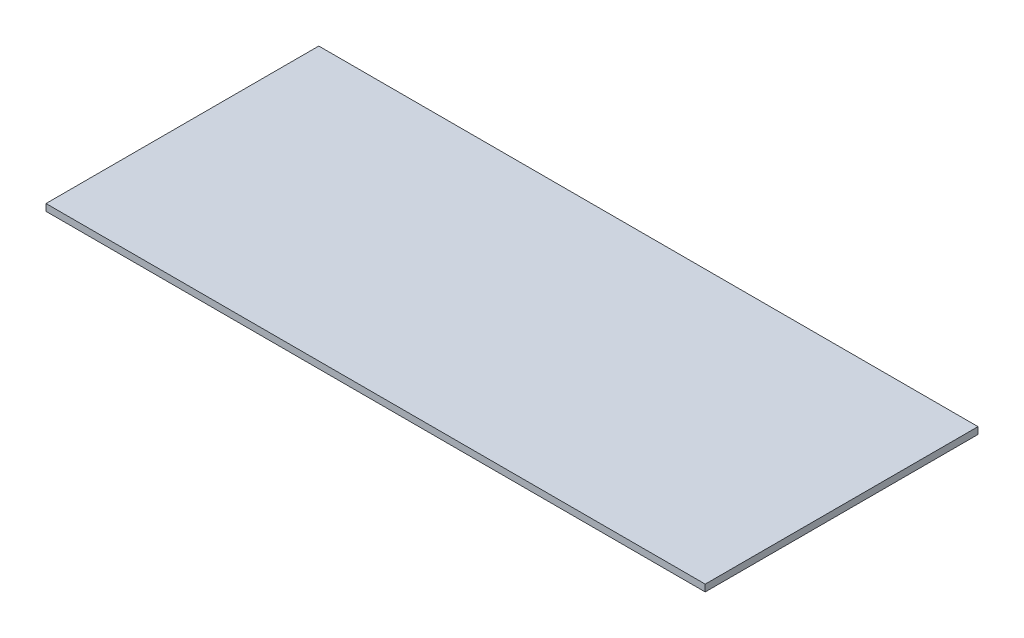
ISO-10303-21;
HEADER;
FILE_DESCRIPTION(('STEP AP214'),'2;1');
FILE_NAME('part.step','',(''),(''),'','','');
FILE_SCHEMA(('AUTOMOTIVE_DESIGN { 1 0 10303 214 1 1 1 1 }'));
ENDSEC;
DATA;
#1=APPLICATION_CONTEXT('core data for automotive mechanical design processes');
#2=APPLICATION_PROTOCOL_DEFINITION('international standard','automotive_design',2000,#1);
#3=PRODUCT_CONTEXT('',#1,'mechanical');
#4=PRODUCT('Part','Part','',(#3));
#5=PRODUCT_RELATED_PRODUCT_CATEGORY('part','',(#4));
#6=PRODUCT_DEFINITION_FORMATION('','',#4);
#7=PRODUCT_DEFINITION_CONTEXT('part definition',#1,'design');
#8=PRODUCT_DEFINITION('design','',#6,#7);
#9=PRODUCT_DEFINITION_SHAPE('','',#8);
#10=(LENGTH_UNIT() NAMED_UNIT(*) SI_UNIT(.MILLI.,.METRE.));
#11=(NAMED_UNIT(*) PLANE_ANGLE_UNIT() SI_UNIT($,.RADIAN.));
#12=(NAMED_UNIT(*) SI_UNIT($,.STERADIAN.) SOLID_ANGLE_UNIT());
#13=UNCERTAINTY_MEASURE_WITH_UNIT(LENGTH_MEASURE(1.E-05),#10,'distance_accuracy_value','');
#14=(GEOMETRIC_REPRESENTATION_CONTEXT(3) GLOBAL_UNCERTAINTY_ASSIGNED_CONTEXT((#13)) GLOBAL_UNIT_ASSIGNED_CONTEXT((#10,
#11,#12)) REPRESENTATION_CONTEXT('',''));
#15=CARTESIAN_POINT('',(0.,0.,0.));
#16=DIRECTION('',(0.,0.,1.));
#17=DIRECTION('',(1.,0.,0.));
#18=AXIS2_PLACEMENT_3D('',#15,#16,#17);
#19=CARTESIAN_POINT('',(0.,3.,0.));
#20=DIRECTION('',(1.,0.,0.));
#21=DIRECTION('',(0.,0.,-1.));
#22=AXIS2_PLACEMENT_3D('',#19,#20,#21);
#23=PLANE('',#22);
#24=DIRECTION('',(0.,0.,1.));
#25=VECTOR('',#24,1.);
#26=CARTESIAN_POINT('',(0.,0.,0.));
#27=LINE('',#26,#25);
#28=CARTESIAN_POINT('',(0.,0.,-120.));
#29=VERTEX_POINT('',#28);
#30=CARTESIAN_POINT('',(0.,0.,0.));
#31=VERTEX_POINT('',#30);
#32=EDGE_CURVE('E98',#29,#31,#27,.T.);
#33=ORIENTED_EDGE('',*,*,#32,.T.);
#34=DIRECTION('',(0.,-1.,0.));
#35=VECTOR('',#34,1.);
#36=CARTESIAN_POINT('',(0.,3.,0.));
#37=LINE('',#36,#35);
#38=CARTESIAN_POINT('',(0.,3.,0.));
#39=VERTEX_POINT('',#38);
#40=EDGE_CURVE('E11',#39,#31,#37,.T.);
#41=ORIENTED_EDGE('',*,*,#40,.F.);
#42=DIRECTION('',(0.,0.,1.));
#43=VECTOR('',#42,1.);
#44=CARTESIAN_POINT('',(0.,3.,0.));
#45=LINE('',#44,#43);
#46=CARTESIAN_POINT('',(0.,3.,-120.));
#47=VERTEX_POINT('',#46);
#48=EDGE_CURVE('E86',#47,#39,#45,.T.);
#49=ORIENTED_EDGE('',*,*,#48,.F.);
#50=DIRECTION('',(0.,-1.,0.));
#51=VECTOR('',#50,1.);
#52=CARTESIAN_POINT('',(0.,3.,-120.));
#53=LINE('',#52,#51);
#54=EDGE_CURVE('E94',#47,#29,#53,.T.);
#55=ORIENTED_EDGE('',*,*,#54,.T.);
#56=EDGE_LOOP('',(#33,#41,#49,#55));
#57=FACE_BOUND('',#56,.T.);
#58=ADVANCED_FACE('F35',(#57),#23,.F.);
#59=CARTESIAN_POINT('',(0.,3.,0.));
#60=DIRECTION('',(0.,0.,-1.));
#61=DIRECTION('',(-1.,0.,0.));
#62=AXIS2_PLACEMENT_3D('',#59,#60,#61);
#63=PLANE('',#62);
#64=DIRECTION('',(1.,0.,0.));
#65=VECTOR('',#64,1.);
#66=CARTESIAN_POINT('',(0.,0.,0.));
#67=LINE('',#66,#65);
#68=CARTESIAN_POINT('',(290.,0.,0.));
#69=VERTEX_POINT('',#68);
#70=EDGE_CURVE('E90',#31,#69,#67,.T.);
#71=ORIENTED_EDGE('',*,*,#70,.T.);
#72=DIRECTION('',(0.,-1.,0.));
#73=VECTOR('',#72,1.);
#74=CARTESIAN_POINT('',(290.,3.,0.));
#75=LINE('',#74,#73);
#76=CARTESIAN_POINT('',(290.,3.,0.));
#77=VERTEX_POINT('',#76);
#78=EDGE_CURVE('E43',#77,#69,#75,.T.);
#79=ORIENTED_EDGE('',*,*,#78,.F.);
#80=DIRECTION('',(1.,0.,0.));
#81=VECTOR('',#80,1.);
#82=CARTESIAN_POINT('',(0.,3.,0.));
#83=LINE('',#82,#81);
#84=EDGE_CURVE('E81',#39,#77,#83,.T.);
#85=ORIENTED_EDGE('',*,*,#84,.F.);
#86=ORIENTED_EDGE('',*,*,#40,.T.);
#87=EDGE_LOOP('',(#71,#79,#85,#86));
#88=FACE_BOUND('',#87,.T.);
#89=ADVANCED_FACE('F89',(#88),#63,.F.);
#90=CARTESIAN_POINT('',(290.,3.,0.));
#91=DIRECTION('',(-1.,0.,0.));
#92=DIRECTION('',(0.,0.,1.));
#93=AXIS2_PLACEMENT_3D('',#90,#91,#92);
#94=PLANE('',#93);
#95=DIRECTION('',(0.,0.,-1.));
#96=VECTOR('',#95,1.);
#97=CARTESIAN_POINT('',(290.,0.,0.));
#98=LINE('',#97,#96);
#99=CARTESIAN_POINT('',(290.,0.,-120.));
#100=VERTEX_POINT('',#99);
#101=EDGE_CURVE('E68',#69,#100,#98,.T.);
#102=ORIENTED_EDGE('',*,*,#101,.T.);
#103=DIRECTION('',(0.,-1.,0.));
#104=VECTOR('',#103,1.);
#105=CARTESIAN_POINT('',(290.,3.,-120.));
#106=LINE('',#105,#104);
#107=CARTESIAN_POINT('',(290.,3.,-120.));
#108=VERTEX_POINT('',#107);
#109=EDGE_CURVE('E91',#108,#100,#106,.T.);
#110=ORIENTED_EDGE('',*,*,#109,.F.);
#111=DIRECTION('',(0.,0.,-1.));
#112=VECTOR('',#111,1.);
#113=CARTESIAN_POINT('',(290.,3.,0.));
#114=LINE('',#113,#112);
#115=EDGE_CURVE('E84',#77,#108,#114,.T.);
#116=ORIENTED_EDGE('',*,*,#115,.F.);
#117=ORIENTED_EDGE('',*,*,#78,.T.);
#118=EDGE_LOOP('',(#102,#110,#116,#117));
#119=FACE_BOUND('',#118,.T.);
#120=ADVANCED_FACE('F92',(#119),#94,.F.);
#121=CARTESIAN_POINT('',(0.,3.,-120.));
#122=DIRECTION('',(0.,0.,1.));
#123=DIRECTION('',(1.,0.,0.));
#124=AXIS2_PLACEMENT_3D('',#121,#122,#123);
#125=PLANE('',#124);
#126=DIRECTION('',(-1.,0.,0.));
#127=VECTOR('',#126,1.);
#128=CARTESIAN_POINT('',(0.,0.,-120.));
#129=LINE('',#128,#127);
#130=EDGE_CURVE('E74',#100,#29,#129,.T.);
#131=ORIENTED_EDGE('',*,*,#130,.T.);
#132=ORIENTED_EDGE('',*,*,#54,.F.);
#133=DIRECTION('',(-1.,0.,0.));
#134=VECTOR('',#133,1.);
#135=CARTESIAN_POINT('',(0.,3.,-120.));
#136=LINE('',#135,#134);
#137=EDGE_CURVE('E51',#108,#47,#136,.T.);
#138=ORIENTED_EDGE('',*,*,#137,.F.);
#139=ORIENTED_EDGE('',*,*,#109,.T.);
#140=EDGE_LOOP('',(#131,#132,#138,#139));
#141=FACE_BOUND('',#140,.T.);
#142=ADVANCED_FACE('F105',(#141),#125,.F.);
#143=CARTESIAN_POINT('',(0.,3.,0.));
#144=DIRECTION('',(0.,-1.,0.));
#145=DIRECTION('',(0.,0.,-1.));
#146=AXIS2_PLACEMENT_3D('',#143,#144,#145);
#147=PLANE('',#146);
#148=ORIENTED_EDGE('',*,*,#48,.T.);
#149=ORIENTED_EDGE('',*,*,#84,.T.);
#150=ORIENTED_EDGE('',*,*,#115,.T.);
#151=ORIENTED_EDGE('',*,*,#137,.T.);
#152=EDGE_LOOP('',(#148,#149,#150,#151));
#153=FACE_BOUND('',#152,.T.);
#154=ADVANCED_FACE('F82',(#153),#147,.F.);
#155=CARTESIAN_POINT('',(0.,0.,0.));
#156=DIRECTION('',(0.,-1.,0.));
#157=DIRECTION('',(0.,0.,-1.));
#158=AXIS2_PLACEMENT_3D('',#155,#156,#157);
#159=PLANE('',#158);
#160=ORIENTED_EDGE('',*,*,#32,.F.);
#161=ORIENTED_EDGE('',*,*,#130,.F.);
#162=ORIENTED_EDGE('',*,*,#101,.F.);
#163=ORIENTED_EDGE('',*,*,#70,.F.);
#164=EDGE_LOOP('',(#160,#161,#162,#163));
#165=FACE_BOUND('',#164,.T.);
#166=ADVANCED_FACE('F108',(#165),#159,.T.);
#167=CLOSED_SHELL('',(#58,#89,#120,#142,#154,#166));
#168=MANIFOLD_SOLID_BREP('B2',#167);
#169=ADVANCED_BREP_SHAPE_REPRESENTATION('',(#18,#168),#14);
#170=SHAPE_DEFINITION_REPRESENTATION(#9,#169);
ENDSEC;
END-ISO-10303-21;
